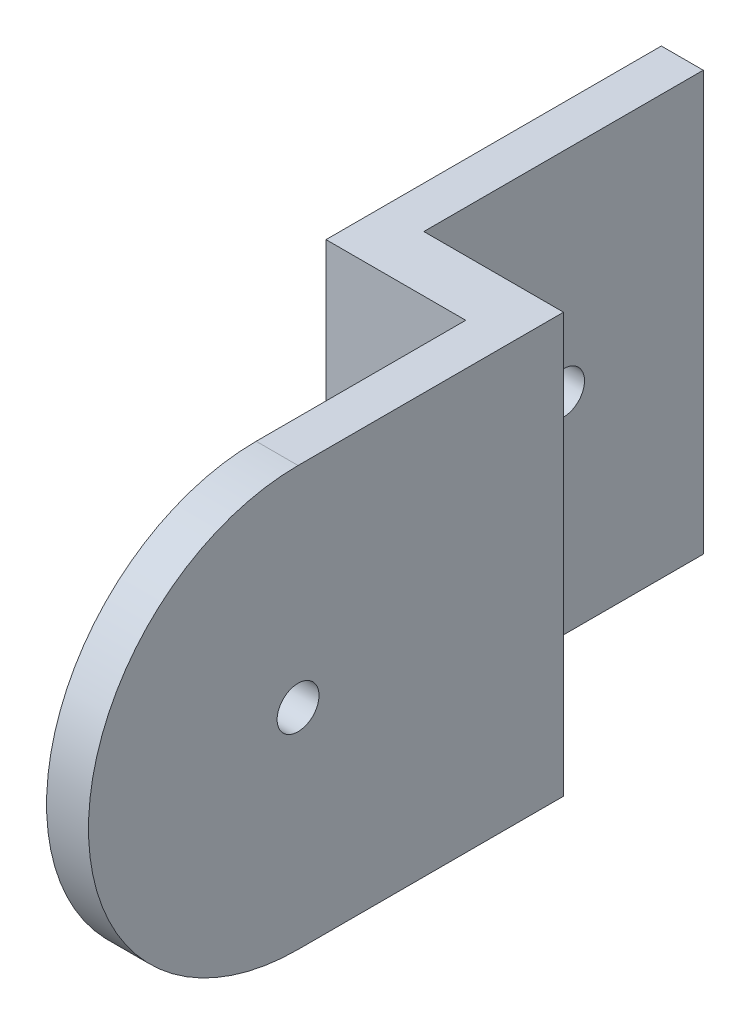
ISO-10303-21;
HEADER;
FILE_DESCRIPTION(('STEP AP214'),'2;1');
FILE_NAME('part.step','',(''),(''),'','','');
FILE_SCHEMA(('AUTOMOTIVE_DESIGN { 1 0 10303 214 1 1 1 1 }'));
ENDSEC;
DATA;
#1=APPLICATION_CONTEXT('core data for automotive mechanical design processes');
#2=APPLICATION_PROTOCOL_DEFINITION('international standard','automotive_design',2000,#1);
#3=PRODUCT_CONTEXT('',#1,'mechanical');
#4=PRODUCT('Part','Part','',(#3));
#5=PRODUCT_RELATED_PRODUCT_CATEGORY('part','',(#4));
#6=PRODUCT_DEFINITION_FORMATION('','',#4);
#7=PRODUCT_DEFINITION_CONTEXT('part definition',#1,'design');
#8=PRODUCT_DEFINITION('design','',#6,#7);
#9=PRODUCT_DEFINITION_SHAPE('','',#8);
#10=(LENGTH_UNIT() NAMED_UNIT(*) SI_UNIT(.MILLI.,.METRE.));
#11=(NAMED_UNIT(*) PLANE_ANGLE_UNIT() SI_UNIT($,.RADIAN.));
#12=(NAMED_UNIT(*) SI_UNIT($,.STERADIAN.) SOLID_ANGLE_UNIT());
#13=UNCERTAINTY_MEASURE_WITH_UNIT(LENGTH_MEASURE(1.E-05),#10,'distance_accuracy_value','');
#14=(GEOMETRIC_REPRESENTATION_CONTEXT(3) GLOBAL_UNCERTAINTY_ASSIGNED_CONTEXT((#13)) GLOBAL_UNIT_ASSIGNED_CONTEXT((#10,
#11,#12)) REPRESENTATION_CONTEXT('',''));
#15=CARTESIAN_POINT('',(0.,0.,0.));
#16=DIRECTION('',(0.,0.,1.));
#17=DIRECTION('',(1.,0.,0.));
#18=AXIS2_PLACEMENT_3D('',#15,#16,#17);
#19=CARTESIAN_POINT('',(0.,-30.,4.));
#20=DIRECTION('',(0.,1.,0.));
#21=DIRECTION('',(0.,0.,1.));
#22=AXIS2_PLACEMENT_3D('',#19,#20,#21);
#23=PLANE('',#22);
#24=DIRECTION('',(1.,0.,0.));
#25=VECTOR('',#24,1.);
#26=CARTESIAN_POINT('',(0.,-30.,0.));
#27=LINE('',#26,#25);
#28=CARTESIAN_POINT('',(3.,-30.,0.));
#29=VERTEX_POINT('',#28);
#30=CARTESIAN_POINT('',(13.,-30.,0.));
#31=VERTEX_POINT('',#30);
#32=EDGE_CURVE('E137',#29,#31,#27,.T.);
#33=ORIENTED_EDGE('',*,*,#32,.T.);
#34=DIRECTION('',(0.,0.,-1.));
#35=VECTOR('',#34,1.);
#36=CARTESIAN_POINT('',(13.,-30.,34.));
#37=LINE('',#36,#35);
#38=CARTESIAN_POINT('',(13.,-30.,19.));
#39=VERTEX_POINT('',#38);
#40=EDGE_CURVE('E122',#39,#31,#37,.T.);
#41=ORIENTED_EDGE('',*,*,#40,.F.);
#42=DIRECTION('',(-1.,0.,0.));
#43=VECTOR('',#42,1.);
#44=CARTESIAN_POINT('',(92.2132034355965,-30.,19.));
#45=LINE('',#44,#43);
#46=CARTESIAN_POINT('',(9.99999999999999,-30.,19.));
#47=VERTEX_POINT('',#46);
#48=EDGE_CURVE('E196',#39,#47,#45,.T.);
#49=ORIENTED_EDGE('',*,*,#48,.T.);
#50=DIRECTION('',(0.,0.,-1.));
#51=VECTOR('',#50,1.);
#52=CARTESIAN_POINT('',(9.99999999999999,-30.,34.));
#53=LINE('',#52,#51);
#54=CARTESIAN_POINT('',(9.99999999999999,-30.,4.));
#55=VERTEX_POINT('',#54);
#56=EDGE_CURVE('E132',#47,#55,#53,.T.);
#57=ORIENTED_EDGE('',*,*,#56,.T.);
#58=DIRECTION('',(1.,0.,0.));
#59=VECTOR('',#58,1.);
#60=CARTESIAN_POINT('',(0.,-30.,4.));
#61=LINE('',#60,#59);
#62=CARTESIAN_POINT('',(0.,-30.,4.));
#63=VERTEX_POINT('',#62);
#64=EDGE_CURVE('E160',#63,#55,#61,.T.);
#65=ORIENTED_EDGE('',*,*,#64,.F.);
#66=DIRECTION('',(0.,0.,-1.));
#67=VECTOR('',#66,1.);
#68=CARTESIAN_POINT('',(0.,-30.,4.));
#69=LINE('',#68,#67);
#70=CARTESIAN_POINT('',(0.,-30.,-20.));
#71=VERTEX_POINT('',#70);
#72=EDGE_CURVE('E12',#63,#71,#69,.T.);
#73=ORIENTED_EDGE('',*,*,#72,.T.);
#74=DIRECTION('',(-1.,0.,0.));
#75=VECTOR('',#74,1.);
#76=CARTESIAN_POINT('',(0.,-30.,-20.));
#77=LINE('',#76,#75);
#78=CARTESIAN_POINT('',(3.,-30.,-20.));
#79=VERTEX_POINT('',#78);
#80=EDGE_CURVE('E168',#79,#71,#77,.T.);
#81=ORIENTED_EDGE('',*,*,#80,.F.);
#82=DIRECTION('',(0.,0.,1.));
#83=VECTOR('',#82,1.);
#84=CARTESIAN_POINT('',(3.,-30.,-20.));
#85=LINE('',#84,#83);
#86=EDGE_CURVE('E145',#79,#29,#85,.T.);
#87=ORIENTED_EDGE('',*,*,#86,.T.);
#88=EDGE_LOOP('',(#33,#41,#49,#57,#65,#73,#81,#87));
#89=FACE_BOUND('',#88,.T.);
#90=ADVANCED_FACE('F56',(#89),#23,.F.);
#91=CARTESIAN_POINT('',(0.,0.,0.));
#92=DIRECTION('',(0.,0.,1.));
#93=DIRECTION('',(1.,0.,0.));
#94=AXIS2_PLACEMENT_3D('',#91,#92,#93);
#95=PLANE('',#94);
#96=DIRECTION('',(-1.,0.,0.));
#97=VECTOR('',#96,1.);
#98=CARTESIAN_POINT('',(0.,0.,0.));
#99=LINE('',#98,#97);
#100=CARTESIAN_POINT('',(13.,0.,0.));
#101=VERTEX_POINT('',#100);
#102=CARTESIAN_POINT('',(3.,0.,0.));
#103=VERTEX_POINT('',#102);
#104=EDGE_CURVE('E139',#101,#103,#99,.T.);
#105=ORIENTED_EDGE('',*,*,#104,.F.);
#106=DIRECTION('',(0.,-1.,0.));
#107=VECTOR('',#106,1.);
#108=CARTESIAN_POINT('',(13.,0.,0.));
#109=LINE('',#108,#107);
#110=EDGE_CURVE('E125',#101,#31,#109,.T.);
#111=ORIENTED_EDGE('',*,*,#110,.T.);
#112=ORIENTED_EDGE('',*,*,#32,.F.);
#113=DIRECTION('',(0.,-1.,0.));
#114=VECTOR('',#113,1.);
#115=CARTESIAN_POINT('',(3.,0.,0.));
#116=LINE('',#115,#114);
#117=EDGE_CURVE('E169',#103,#29,#116,.T.);
#118=ORIENTED_EDGE('',*,*,#117,.F.);
#119=EDGE_LOOP('',(#105,#111,#112,#118));
#120=FACE_BOUND('',#119,.T.);
#121=ADVANCED_FACE('F135',(#120),#95,.F.);
#122=CARTESIAN_POINT('',(0.,0.,4.));
#123=DIRECTION('',(1.,0.,0.));
#124=DIRECTION('',(0.,1.,0.));
#125=AXIS2_PLACEMENT_3D('',#122,#123,#124);
#126=PLANE('',#125);
#127=CARTESIAN_POINT('',(0.,-15.,-10.));
#128=DIRECTION('',(-1.,0.,0.));
#129=DIRECTION('',(0.,-1.,0.));
#130=AXIS2_PLACEMENT_3D('',#127,#128,#129);
#131=CIRCLE('',#130,1.5);
#132=CARTESIAN_POINT('',(0.,-16.5,-10.));
#133=VERTEX_POINT('',#132);
#134=EDGE_CURVE('E183',#133,#133,#131,.T.);
#135=ORIENTED_EDGE('',*,*,#134,.F.);
#136=EDGE_LOOP('',(#135));
#137=FACE_BOUND('',#136,.T.);
#138=DIRECTION('',(0.,0.,-1.));
#139=VECTOR('',#138,1.);
#140=CARTESIAN_POINT('',(0.,0.,4.));
#141=LINE('',#140,#139);
#142=CARTESIAN_POINT('',(0.,0.,4.));
#143=VERTEX_POINT('',#142);
#144=CARTESIAN_POINT('',(0.,0.,-20.));
#145=VERTEX_POINT('',#144);
#146=EDGE_CURVE('E64',#143,#145,#141,.T.);
#147=ORIENTED_EDGE('',*,*,#146,.T.);
#148=DIRECTION('',(0.,1.,0.));
#149=VECTOR('',#148,1.);
#150=CARTESIAN_POINT('',(0.,0.,-20.));
#151=LINE('',#150,#149);
#152=EDGE_CURVE('E171',#71,#145,#151,.T.);
#153=ORIENTED_EDGE('',*,*,#152,.F.);
#154=ORIENTED_EDGE('',*,*,#72,.F.);
#155=DIRECTION('',(0.,-1.,0.));
#156=VECTOR('',#155,1.);
#157=CARTESIAN_POINT('',(0.,0.,4.));
#158=LINE('',#157,#156);
#159=EDGE_CURVE('E148',#143,#63,#158,.T.);
#160=ORIENTED_EDGE('',*,*,#159,.F.);
#161=EDGE_LOOP('',(#147,#153,#154,#160));
#162=FACE_BOUND('',#161,.T.);
#163=ADVANCED_FACE('F58',(#137,#162),#126,.F.);
#164=CARTESIAN_POINT('',(0.,0.,4.));
#165=DIRECTION('',(0.,-1.,0.));
#166=DIRECTION('',(0.,0.,-1.));
#167=AXIS2_PLACEMENT_3D('',#164,#165,#166);
#168=PLANE('',#167);
#169=DIRECTION('',(0.,0.,-1.));
#170=VECTOR('',#169,1.);
#171=CARTESIAN_POINT('',(13.,0.,34.));
#172=LINE('',#171,#170);
#173=CARTESIAN_POINT('',(13.,0.,19.));
#174=VERTEX_POINT('',#173);
#175=EDGE_CURVE('E71',#174,#101,#172,.T.);
#176=ORIENTED_EDGE('',*,*,#175,.T.);
#177=ORIENTED_EDGE('',*,*,#104,.T.);
#178=DIRECTION('',(0.,0.,1.));
#179=VECTOR('',#178,1.);
#180=CARTESIAN_POINT('',(3.,0.,-20.));
#181=LINE('',#180,#179);
#182=CARTESIAN_POINT('',(3.,0.,-20.));
#183=VERTEX_POINT('',#182);
#184=EDGE_CURVE('E146',#183,#103,#181,.T.);
#185=ORIENTED_EDGE('',*,*,#184,.F.);
#186=DIRECTION('',(1.,0.,0.));
#187=VECTOR('',#186,1.);
#188=CARTESIAN_POINT('',(0.,0.,-20.));
#189=LINE('',#188,#187);
#190=EDGE_CURVE('E177',#145,#183,#189,.T.);
#191=ORIENTED_EDGE('',*,*,#190,.F.);
#192=ORIENTED_EDGE('',*,*,#146,.F.);
#193=DIRECTION('',(-1.,0.,0.));
#194=VECTOR('',#193,1.);
#195=CARTESIAN_POINT('',(0.,0.,4.));
#196=LINE('',#195,#194);
#197=CARTESIAN_POINT('',(9.99999999999999,0.,4.));
#198=VERTEX_POINT('',#197);
#199=EDGE_CURVE('E153',#198,#143,#196,.T.);
#200=ORIENTED_EDGE('',*,*,#199,.F.);
#201=DIRECTION('',(0.,0.,-1.));
#202=VECTOR('',#201,1.);
#203=CARTESIAN_POINT('',(9.99999999999999,0.,34.));
#204=LINE('',#203,#202);
#205=CARTESIAN_POINT('',(9.99999999999999,0.,19.));
#206=VERTEX_POINT('',#205);
#207=EDGE_CURVE('E79',#206,#198,#204,.T.);
#208=ORIENTED_EDGE('',*,*,#207,.F.);
#209=DIRECTION('',(-1.,0.,0.));
#210=VECTOR('',#209,1.);
#211=CARTESIAN_POINT('',(92.2132034355965,0.,19.));
#212=LINE('',#211,#210);
#213=EDGE_CURVE('E192',#174,#206,#212,.T.);
#214=ORIENTED_EDGE('',*,*,#213,.F.);
#215=EDGE_LOOP('',(#176,#177,#185,#191,#192,#200,#208,#214));
#216=FACE_BOUND('',#215,.T.);
#217=ADVANCED_FACE('F214',(#216),#168,.F.);
#218=CARTESIAN_POINT('',(0.,0.,4.));
#219=DIRECTION('',(0.,0.,1.));
#220=DIRECTION('',(1.,0.,0.));
#221=AXIS2_PLACEMENT_3D('',#218,#219,#220);
#222=PLANE('',#221);
#223=DIRECTION('',(0.,-1.,0.));
#224=VECTOR('',#223,1.);
#225=CARTESIAN_POINT('',(9.99999999999999,0.,4.));
#226=LINE('',#225,#224);
#227=EDGE_CURVE('E189',#198,#55,#226,.T.);
#228=ORIENTED_EDGE('',*,*,#227,.F.);
#229=ORIENTED_EDGE('',*,*,#199,.T.);
#230=ORIENTED_EDGE('',*,*,#159,.T.);
#231=ORIENTED_EDGE('',*,*,#64,.T.);
#232=EDGE_LOOP('',(#228,#229,#230,#231));
#233=FACE_BOUND('',#232,.T.);
#234=ADVANCED_FACE('F217',(#233),#222,.T.);
#235=CARTESIAN_POINT('',(3.,0.,-20.));
#236=DIRECTION('',(-1.,0.,0.));
#237=DIRECTION('',(0.,-1.,0.));
#238=AXIS2_PLACEMENT_3D('',#235,#236,#237);
#239=PLANE('',#238);
#240=CARTESIAN_POINT('',(3.,-15.,-10.));
#241=DIRECTION('',(-1.,0.,0.));
#242=DIRECTION('',(0.,-1.,0.));
#243=AXIS2_PLACEMENT_3D('',#240,#241,#242);
#244=CIRCLE('',#243,1.5);
#245=CARTESIAN_POINT('',(3.,-16.5,-10.));
#246=VERTEX_POINT('',#245);
#247=EDGE_CURVE('E172',#246,#246,#244,.T.);
#248=ORIENTED_EDGE('',*,*,#247,.T.);
#249=EDGE_LOOP('',(#248));
#250=FACE_BOUND('',#249,.T.);
#251=ORIENTED_EDGE('',*,*,#117,.T.);
#252=ORIENTED_EDGE('',*,*,#86,.F.);
#253=DIRECTION('',(0.,-1.,0.));
#254=VECTOR('',#253,1.);
#255=CARTESIAN_POINT('',(3.,0.,-20.));
#256=LINE('',#255,#254);
#257=EDGE_CURVE('E175',#183,#79,#256,.T.);
#258=ORIENTED_EDGE('',*,*,#257,.F.);
#259=ORIENTED_EDGE('',*,*,#184,.T.);
#260=EDGE_LOOP('',(#251,#252,#258,#259));
#261=FACE_BOUND('',#260,.T.);
#262=ADVANCED_FACE('F219',(#250,#261),#239,.F.);
#263=CARTESIAN_POINT('',(0.,0.,-20.));
#264=DIRECTION('',(0.,0.,1.));
#265=DIRECTION('',(1.,0.,0.));
#266=AXIS2_PLACEMENT_3D('',#263,#264,#265);
#267=PLANE('',#266);
#268=ORIENTED_EDGE('',*,*,#152,.T.);
#269=ORIENTED_EDGE('',*,*,#190,.T.);
#270=ORIENTED_EDGE('',*,*,#257,.T.);
#271=ORIENTED_EDGE('',*,*,#80,.T.);
#272=EDGE_LOOP('',(#268,#269,#270,#271));
#273=FACE_BOUND('',#272,.T.);
#274=ADVANCED_FACE('F225',(#273),#267,.F.);
#275=CARTESIAN_POINT('',(85.2426406871193,-15.,-10.));
#276=DIRECTION('',(-1.,0.,0.));
#277=DIRECTION('',(0.,-1.,0.));
#278=AXIS2_PLACEMENT_3D('',#275,#276,#277);
#279=CYLINDRICAL_SURFACE('',#278,1.5);
#280=ORIENTED_EDGE('',*,*,#134,.T.);
#281=EDGE_LOOP('',(#280));
#282=FACE_BOUND('',#281,.T.);
#283=ORIENTED_EDGE('',*,*,#247,.F.);
#284=EDGE_LOOP('',(#283));
#285=FACE_BOUND('',#284,.T.);
#286=ADVANCED_FACE('F209',(#282,#285),#279,.F.);
#287=CARTESIAN_POINT('',(9.99999999999999,0.,34.));
#288=DIRECTION('',(1.,0.,0.));
#289=DIRECTION('',(0.,0.,-1.));
#290=AXIS2_PLACEMENT_3D('',#287,#288,#289);
#291=PLANE('',#290);
#292=CARTESIAN_POINT('',(9.99999999999999,-15.,19.));
#293=DIRECTION('',(-1.,0.,0.));
#294=DIRECTION('',(0.,0.,1.));
#295=AXIS2_PLACEMENT_3D('',#292,#293,#294);
#296=CIRCLE('',#295,1.5);
#297=CARTESIAN_POINT('',(9.99999999999999,-15.,20.5));
#298=VERTEX_POINT('',#297);
#299=EDGE_CURVE('E140',#298,#298,#296,.T.);
#300=ORIENTED_EDGE('',*,*,#299,.F.);
#301=EDGE_LOOP('',(#300));
#302=FACE_BOUND('',#301,.T.);
#303=ORIENTED_EDGE('',*,*,#56,.F.);
#304=CARTESIAN_POINT('',(9.99999999999999,-15.,19.));
#305=DIRECTION('',(-1.,0.,0.));
#306=DIRECTION('',(0.,0.,1.));
#307=AXIS2_PLACEMENT_3D('',#304,#305,#306);
#308=CIRCLE('',#307,15.);
#309=EDGE_CURVE('E194',#206,#47,#308,.F.);
#310=ORIENTED_EDGE('',*,*,#309,.F.);
#311=ORIENTED_EDGE('',*,*,#207,.T.);
#312=ORIENTED_EDGE('',*,*,#227,.T.);
#313=EDGE_LOOP('',(#303,#310,#311,#312));
#314=FACE_BOUND('',#313,.T.);
#315=ADVANCED_FACE('F207',(#302,#314),#291,.F.);
#316=CARTESIAN_POINT('',(13.,0.,34.));
#317=DIRECTION('',(-1.,0.,0.));
#318=DIRECTION('',(0.,0.,1.));
#319=AXIS2_PLACEMENT_3D('',#316,#317,#318);
#320=PLANE('',#319);
#321=CARTESIAN_POINT('',(13.,-15.,19.));
#322=DIRECTION('',(-1.,0.,0.));
#323=DIRECTION('',(0.,0.,1.));
#324=AXIS2_PLACEMENT_3D('',#321,#322,#323);
#325=CIRCLE('',#324,1.5);
#326=CARTESIAN_POINT('',(13.,-15.,20.5));
#327=VERTEX_POINT('',#326);
#328=EDGE_CURVE('E198',#327,#327,#325,.T.);
#329=ORIENTED_EDGE('',*,*,#328,.T.);
#330=EDGE_LOOP('',(#329));
#331=FACE_BOUND('',#330,.T.);
#332=CARTESIAN_POINT('',(13.,-15.,19.));
#333=DIRECTION('',(-1.,0.,0.));
#334=DIRECTION('',(0.,0.,1.));
#335=AXIS2_PLACEMENT_3D('',#332,#333,#334);
#336=CIRCLE('',#335,15.);
#337=EDGE_CURVE('E127',#174,#39,#336,.F.);
#338=ORIENTED_EDGE('',*,*,#337,.T.);
#339=ORIENTED_EDGE('',*,*,#40,.T.);
#340=ORIENTED_EDGE('',*,*,#110,.F.);
#341=ORIENTED_EDGE('',*,*,#175,.F.);
#342=EDGE_LOOP('',(#338,#339,#340,#341));
#343=FACE_BOUND('',#342,.T.);
#344=ADVANCED_FACE('F124',(#331,#343),#320,.F.);
#345=CARTESIAN_POINT('',(92.2132034355965,-15.,19.));
#346=DIRECTION('',(-1.,0.,0.));
#347=DIRECTION('',(0.,0.,1.));
#348=AXIS2_PLACEMENT_3D('',#345,#346,#347);
#349=CYLINDRICAL_SURFACE('',#348,15.);
#350=ORIENTED_EDGE('',*,*,#213,.T.);
#351=ORIENTED_EDGE('',*,*,#309,.T.);
#352=ORIENTED_EDGE('',*,*,#48,.F.);
#353=ORIENTED_EDGE('',*,*,#337,.F.);
#354=EDGE_LOOP('',(#350,#351,#352,#353));
#355=FACE_BOUND('',#354,.T.);
#356=ADVANCED_FACE('F213',(#355),#349,.T.);
#357=CARTESIAN_POINT('',(75.2426406871193,-15.,19.));
#358=DIRECTION('',(-1.,0.,0.));
#359=DIRECTION('',(0.,0.,1.));
#360=AXIS2_PLACEMENT_3D('',#357,#358,#359);
#361=CYLINDRICAL_SURFACE('',#360,1.5);
#362=ORIENTED_EDGE('',*,*,#299,.T.);
#363=EDGE_LOOP('',(#362));
#364=FACE_BOUND('',#363,.T.);
#365=ORIENTED_EDGE('',*,*,#328,.F.);
#366=EDGE_LOOP('',(#365));
#367=FACE_BOUND('',#366,.T.);
#368=ADVANCED_FACE('F204',(#364,#367),#361,.F.);
#369=CLOSED_SHELL('',(#90,#121,#163,#217,#234,#262,#274,#286,#315,#344,#356,#368));
#370=MANIFOLD_SOLID_BREP('B2',#369);
#371=ADVANCED_BREP_SHAPE_REPRESENTATION('',(#18,#370),#14);
#372=SHAPE_DEFINITION_REPRESENTATION(#9,#371);
ENDSEC;
END-ISO-10303-21;
